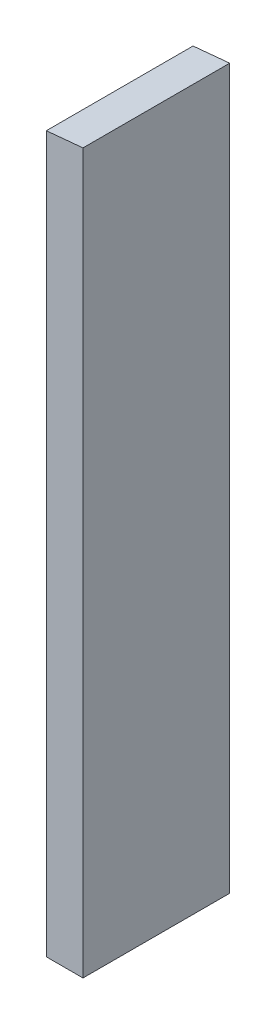
ISO-10303-21;
HEADER;
FILE_DESCRIPTION(('STEP AP214'),'2;1');
FILE_NAME('part.step','',(''),(''),'','','');
FILE_SCHEMA(('AUTOMOTIVE_DESIGN { 1 0 10303 214 1 1 1 1 }'));
ENDSEC;
DATA;
#1=APPLICATION_CONTEXT('core data for automotive mechanical design processes');
#2=APPLICATION_PROTOCOL_DEFINITION('international standard','automotive_design',2000,#1);
#3=PRODUCT_CONTEXT('',#1,'mechanical');
#4=PRODUCT('Part','Part','',(#3));
#5=PRODUCT_RELATED_PRODUCT_CATEGORY('part','',(#4));
#6=PRODUCT_DEFINITION_FORMATION('','',#4);
#7=PRODUCT_DEFINITION_CONTEXT('part definition',#1,'design');
#8=PRODUCT_DEFINITION('design','',#6,#7);
#9=PRODUCT_DEFINITION_SHAPE('','',#8);
#10=(LENGTH_UNIT() NAMED_UNIT(*) SI_UNIT(.MILLI.,.METRE.));
#11=(NAMED_UNIT(*) PLANE_ANGLE_UNIT() SI_UNIT($,.RADIAN.));
#12=(NAMED_UNIT(*) SI_UNIT($,.STERADIAN.) SOLID_ANGLE_UNIT());
#13=UNCERTAINTY_MEASURE_WITH_UNIT(LENGTH_MEASURE(1.E-05),#10,'distance_accuracy_value','');
#14=(GEOMETRIC_REPRESENTATION_CONTEXT(3) GLOBAL_UNCERTAINTY_ASSIGNED_CONTEXT((#13)) GLOBAL_UNIT_ASSIGNED_CONTEXT((#10,
#11,#12)) REPRESENTATION_CONTEXT('',''));
#15=CARTESIAN_POINT('',(0.,0.,0.));
#16=DIRECTION('',(0.,0.,1.));
#17=DIRECTION('',(1.,0.,0.));
#18=AXIS2_PLACEMENT_3D('',#15,#16,#17);
#19=CARTESIAN_POINT('',(0.,0.,25.4));
#20=DIRECTION('',(1.,0.,0.));
#21=DIRECTION('',(0.,1.,0.));
#22=AXIS2_PLACEMENT_3D('',#19,#20,#21);
#23=PLANE('',#22);
#24=DIRECTION('',(0.,-1.,0.));
#25=VECTOR('',#24,1.);
#26=CARTESIAN_POINT('',(0.,0.,0.));
#27=LINE('',#26,#25);
#28=CARTESIAN_POINT('',(0.,123.859748272012,0.));
#29=VERTEX_POINT('',#28);
#30=CARTESIAN_POINT('',(0.,0.,0.));
#31=VERTEX_POINT('',#30);
#32=EDGE_CURVE('E96',#29,#31,#27,.T.);
#33=ORIENTED_EDGE('',*,*,#32,.T.);
#34=DIRECTION('',(0.,0.,-1.));
#35=VECTOR('',#34,1.);
#36=CARTESIAN_POINT('',(0.,0.,25.4));
#37=LINE('',#36,#35);
#38=CARTESIAN_POINT('',(0.,0.,25.4));
#39=VERTEX_POINT('',#38);
#40=EDGE_CURVE('E11',#39,#31,#37,.T.);
#41=ORIENTED_EDGE('',*,*,#40,.F.);
#42=DIRECTION('',(0.,-1.,0.));
#43=VECTOR('',#42,1.);
#44=CARTESIAN_POINT('',(0.,0.,25.4));
#45=LINE('',#44,#43);
#46=CARTESIAN_POINT('',(0.,123.859748272012,25.4));
#47=VERTEX_POINT('',#46);
#48=EDGE_CURVE('E84',#47,#39,#45,.T.);
#49=ORIENTED_EDGE('',*,*,#48,.F.);
#50=DIRECTION('',(0.,0.,-1.));
#51=VECTOR('',#50,1.);
#52=CARTESIAN_POINT('',(0.,123.859748272012,25.4));
#53=LINE('',#52,#51);
#54=EDGE_CURVE('E92',#47,#29,#53,.T.);
#55=ORIENTED_EDGE('',*,*,#54,.T.);
#56=EDGE_LOOP('',(#33,#41,#49,#55));
#57=FACE_BOUND('',#56,.T.);
#58=ADVANCED_FACE('F33',(#57),#23,.F.);
#59=CARTESIAN_POINT('',(0.,0.,25.4));
#60=DIRECTION('',(0.,1.,0.));
#61=DIRECTION('',(0.,0.,1.));
#62=AXIS2_PLACEMENT_3D('',#59,#60,#61);
#63=PLANE('',#62);
#64=DIRECTION('',(1.,0.,0.));
#65=VECTOR('',#64,1.);
#66=CARTESIAN_POINT('',(0.,0.,0.));
#67=LINE('',#66,#65);
#68=CARTESIAN_POINT('',(6.35,0.,0.));
#69=VERTEX_POINT('',#68);
#70=EDGE_CURVE('E88',#31,#69,#67,.T.);
#71=ORIENTED_EDGE('',*,*,#70,.T.);
#72=DIRECTION('',(0.,0.,-1.));
#73=VECTOR('',#72,1.);
#74=CARTESIAN_POINT('',(6.35,0.,25.4));
#75=LINE('',#74,#73);
#76=CARTESIAN_POINT('',(6.35,0.,25.4));
#77=VERTEX_POINT('',#76);
#78=EDGE_CURVE('E41',#77,#69,#75,.T.);
#79=ORIENTED_EDGE('',*,*,#78,.F.);
#80=DIRECTION('',(1.,0.,0.));
#81=VECTOR('',#80,1.);
#82=CARTESIAN_POINT('',(0.,0.,25.4));
#83=LINE('',#82,#81);
#84=EDGE_CURVE('E79',#39,#77,#83,.T.);
#85=ORIENTED_EDGE('',*,*,#84,.F.);
#86=ORIENTED_EDGE('',*,*,#40,.T.);
#87=EDGE_LOOP('',(#71,#79,#85,#86));
#88=FACE_BOUND('',#87,.T.);
#89=ADVANCED_FACE('F87',(#88),#63,.F.);
#90=CARTESIAN_POINT('',(6.35,0.,25.4));
#91=DIRECTION('',(-1.,0.,0.));
#92=DIRECTION('',(0.,0.,1.));
#93=AXIS2_PLACEMENT_3D('',#90,#91,#92);
#94=PLANE('',#93);
#95=DIRECTION('',(0.,1.,0.));
#96=VECTOR('',#95,1.);
#97=CARTESIAN_POINT('',(6.35,0.,0.));
#98=LINE('',#97,#96);
#99=CARTESIAN_POINT('',(6.35,124.46,0.));
#100=VERTEX_POINT('',#99);
#101=EDGE_CURVE('E66',#69,#100,#98,.T.);
#102=ORIENTED_EDGE('',*,*,#101,.T.);
#103=DIRECTION('',(0.,0.,-1.));
#104=VECTOR('',#103,1.);
#105=CARTESIAN_POINT('',(6.35,124.46,25.4));
#106=LINE('',#105,#104);
#107=CARTESIAN_POINT('',(6.35,124.46,25.4));
#108=VERTEX_POINT('',#107);
#109=EDGE_CURVE('E89',#108,#100,#106,.T.);
#110=ORIENTED_EDGE('',*,*,#109,.F.);
#111=DIRECTION('',(0.,1.,0.));
#112=VECTOR('',#111,1.);
#113=CARTESIAN_POINT('',(6.35,0.,25.4));
#114=LINE('',#113,#112);
#115=EDGE_CURVE('E82',#77,#108,#114,.T.);
#116=ORIENTED_EDGE('',*,*,#115,.F.);
#117=ORIENTED_EDGE('',*,*,#78,.T.);
#118=EDGE_LOOP('',(#102,#110,#116,#117));
#119=FACE_BOUND('',#118,.T.);
#120=ADVANCED_FACE('F90',(#119),#94,.F.);
#121=CARTESIAN_POINT('',(0.,123.859748272012,25.4));
#122=DIRECTION('',(0.094108313318517,-0.99556196460308,0.));
#123=DIRECTION('',(0.99556196460308,0.094108313318517,0.));
#124=AXIS2_PLACEMENT_3D('',#121,#122,#123);
#125=PLANE('',#124);
#126=DIRECTION('',(-0.99556196460308,-0.094108313318517,0.));
#127=VECTOR('',#126,1.);
#128=CARTESIAN_POINT('',(0.,123.859748272012,0.));
#129=LINE('',#128,#127);
#130=EDGE_CURVE('E72',#100,#29,#129,.T.);
#131=ORIENTED_EDGE('',*,*,#130,.T.);
#132=ORIENTED_EDGE('',*,*,#54,.F.);
#133=DIRECTION('',(-0.99556196460308,-0.094108313318517,0.));
#134=VECTOR('',#133,1.);
#135=CARTESIAN_POINT('',(0.,123.859748272012,25.4));
#136=LINE('',#135,#134);
#137=EDGE_CURVE('E49',#108,#47,#136,.T.);
#138=ORIENTED_EDGE('',*,*,#137,.F.);
#139=ORIENTED_EDGE('',*,*,#109,.T.);
#140=EDGE_LOOP('',(#131,#132,#138,#139));
#141=FACE_BOUND('',#140,.T.);
#142=ADVANCED_FACE('F103',(#141),#125,.F.);
#143=CARTESIAN_POINT('',(0.,0.,25.4));
#144=DIRECTION('',(0.,0.,-1.));
#145=DIRECTION('',(-1.,0.,0.));
#146=AXIS2_PLACEMENT_3D('',#143,#144,#145);
#147=PLANE('',#146);
#148=ORIENTED_EDGE('',*,*,#48,.T.);
#149=ORIENTED_EDGE('',*,*,#84,.T.);
#150=ORIENTED_EDGE('',*,*,#115,.T.);
#151=ORIENTED_EDGE('',*,*,#137,.T.);
#152=EDGE_LOOP('',(#148,#149,#150,#151));
#153=FACE_BOUND('',#152,.T.);
#154=ADVANCED_FACE('F80',(#153),#147,.F.);
#155=CARTESIAN_POINT('',(0.,0.,0.));
#156=DIRECTION('',(0.,0.,-1.));
#157=DIRECTION('',(-1.,0.,0.));
#158=AXIS2_PLACEMENT_3D('',#155,#156,#157);
#159=PLANE('',#158);
#160=ORIENTED_EDGE('',*,*,#32,.F.);
#161=ORIENTED_EDGE('',*,*,#130,.F.);
#162=ORIENTED_EDGE('',*,*,#101,.F.);
#163=ORIENTED_EDGE('',*,*,#70,.F.);
#164=EDGE_LOOP('',(#160,#161,#162,#163));
#165=FACE_BOUND('',#164,.T.);
#166=ADVANCED_FACE('F106',(#165),#159,.T.);
#167=CLOSED_SHELL('',(#58,#89,#120,#142,#154,#166));
#168=MANIFOLD_SOLID_BREP('B2',#167);
#169=ADVANCED_BREP_SHAPE_REPRESENTATION('',(#18,#168),#14);
#170=SHAPE_DEFINITION_REPRESENTATION(#9,#169);
ENDSEC;
END-ISO-10303-21;
